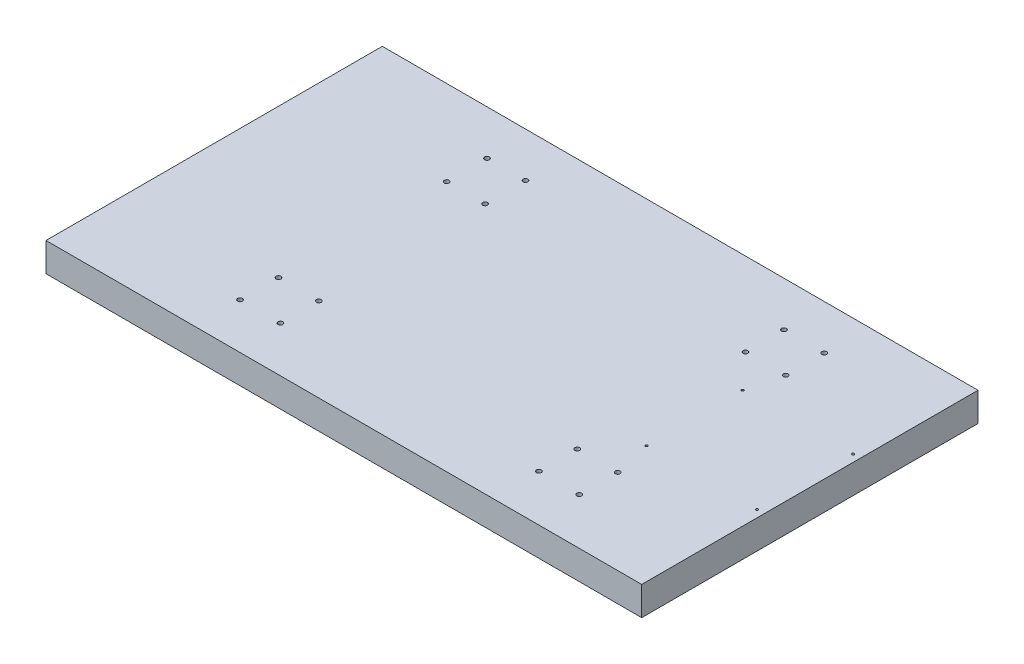
ISO-10303-21;
HEADER;
FILE_DESCRIPTION(('STEP AP214'),'2;1');
FILE_NAME('part.step','',(''),(''),'','','');
FILE_SCHEMA(('AUTOMOTIVE_DESIGN { 1 0 10303 214 1 1 1 1 }'));
ENDSEC;
DATA;
#1=APPLICATION_CONTEXT('core data for automotive mechanical design processes');
#2=APPLICATION_PROTOCOL_DEFINITION('international standard','automotive_design',2000,#1);
#3=PRODUCT_CONTEXT('',#1,'mechanical');
#4=PRODUCT('Part','Part','',(#3));
#5=PRODUCT_RELATED_PRODUCT_CATEGORY('part','',(#4));
#6=PRODUCT_DEFINITION_FORMATION('','',#4);
#7=PRODUCT_DEFINITION_CONTEXT('part definition',#1,'design');
#8=PRODUCT_DEFINITION('design','',#6,#7);
#9=PRODUCT_DEFINITION_SHAPE('','',#8);
#10=(LENGTH_UNIT() NAMED_UNIT(*) SI_UNIT(.MILLI.,.METRE.));
#11=(NAMED_UNIT(*) PLANE_ANGLE_UNIT() SI_UNIT($,.RADIAN.));
#12=(NAMED_UNIT(*) SI_UNIT($,.STERADIAN.) SOLID_ANGLE_UNIT());
#13=UNCERTAINTY_MEASURE_WITH_UNIT(LENGTH_MEASURE(1.E-05),#10,'distance_accuracy_value','');
#14=(GEOMETRIC_REPRESENTATION_CONTEXT(3) GLOBAL_UNCERTAINTY_ASSIGNED_CONTEXT((#13)) GLOBAL_UNIT_ASSIGNED_CONTEXT((#10,
#11,#12)) REPRESENTATION_CONTEXT('',''));
#15=CARTESIAN_POINT('',(0.,0.,0.));
#16=DIRECTION('',(0.,0.,1.));
#17=DIRECTION('',(1.,0.,0.));
#18=AXIS2_PLACEMENT_3D('',#15,#16,#17);
#19=CARTESIAN_POINT('',(-876.3,76.2,-444.5));
#20=DIRECTION('',(0.,0.,1.));
#21=DIRECTION('',(1.,0.,0.));
#22=AXIS2_PLACEMENT_3D('',#19,#20,#21);
#23=PLANE('',#22);
#24=CARTESIAN_POINT('',(-190.500000000017,38.1000000000064,-444.5));
#25=DIRECTION('',(0.,0.,-1.));
#26=DIRECTION('',(-1.,0.,0.));
#27=AXIS2_PLACEMENT_3D('',#24,#25,#26);
#28=CIRCLE('',#27,6.34999999998246);
#29=CARTESIAN_POINT('',(-196.849999999999,38.1000000000064,-444.5));
#30=VERTEX_POINT('',#29);
#31=EDGE_CURVE('E268',#30,#30,#28,.T.);
#32=ORIENTED_EDGE('',*,*,#31,.F.);
#33=EDGE_LOOP('',(#32));
#34=FACE_BOUND('',#33,.T.);
#35=CARTESIAN_POINT('',(-647.700000000017,38.1000000000063,-444.5));
#36=DIRECTION('',(0.,0.,-1.));
#37=DIRECTION('',(-1.,0.,0.));
#38=AXIS2_PLACEMENT_3D('',#35,#36,#37);
#39=CIRCLE('',#38,6.34999999998258);
#40=CARTESIAN_POINT('',(-654.049999999999,38.1000000000063,-444.5));
#41=VERTEX_POINT('',#40);
#42=EDGE_CURVE('E263',#41,#41,#39,.T.);
#43=ORIENTED_EDGE('',*,*,#42,.F.);
#44=EDGE_LOOP('',(#43));
#45=FACE_BOUND('',#44,.T.);
#46=DIRECTION('',(0.,1.,0.));
#47=VECTOR('',#46,1.);
#48=CARTESIAN_POINT('',(368.3,0.,-444.5));
#49=LINE('',#48,#47);
#50=CARTESIAN_POINT('',(368.3,0.,-444.5));
#51=VERTEX_POINT('',#50);
#52=CARTESIAN_POINT('',(368.3,76.2,-444.5));
#53=VERTEX_POINT('',#52);
#54=EDGE_CURVE('E91',#51,#53,#49,.T.);
#55=ORIENTED_EDGE('',*,*,#54,.F.);
#56=DIRECTION('',(-1.,0.,0.));
#57=VECTOR('',#56,1.);
#58=CARTESIAN_POINT('',(-876.3,0.,-444.5));
#59=LINE('',#58,#57);
#60=CARTESIAN_POINT('',(-1206.5,0.,-444.5));
#61=VERTEX_POINT('',#60);
#62=EDGE_CURVE('E99',#51,#61,#59,.T.);
#63=ORIENTED_EDGE('',*,*,#62,.T.);
#64=DIRECTION('',(0.,-1.,0.));
#65=VECTOR('',#64,1.);
#66=CARTESIAN_POINT('',(-1206.5,76.2,-444.5));
#67=LINE('',#66,#65);
#68=CARTESIAN_POINT('',(-1206.5,76.2,-444.5));
#69=VERTEX_POINT('',#68);
#70=EDGE_CURVE('E123',#69,#61,#67,.T.);
#71=ORIENTED_EDGE('',*,*,#70,.F.);
#72=DIRECTION('',(-1.,0.,0.));
#73=VECTOR('',#72,1.);
#74=CARTESIAN_POINT('',(-876.3,76.2,-444.5));
#75=LINE('',#74,#73);
#76=EDGE_CURVE('E56',#53,#69,#75,.T.);
#77=ORIENTED_EDGE('',*,*,#76,.F.);
#78=EDGE_LOOP('',(#55,#63,#71,#77));
#79=FACE_BOUND('',#78,.T.);
#80=ADVANCED_FACE('F47',(#34,#45,#79),#23,.F.);
#81=CARTESIAN_POINT('',(-876.3,76.2,444.5));
#82=DIRECTION('',(0.,0.,-1.));
#83=DIRECTION('',(-1.,0.,0.));
#84=AXIS2_PLACEMENT_3D('',#81,#82,#83);
#85=PLANE('',#84);
#86=DIRECTION('',(0.,-1.,0.));
#87=VECTOR('',#86,1.);
#88=CARTESIAN_POINT('',(368.3,76.2,444.5));
#89=LINE('',#88,#87);
#90=CARTESIAN_POINT('',(368.3,76.2,444.5));
#91=VERTEX_POINT('',#90);
#92=CARTESIAN_POINT('',(368.3,0.,444.5));
#93=VERTEX_POINT('',#92);
#94=EDGE_CURVE('E64',#91,#93,#89,.T.);
#95=ORIENTED_EDGE('',*,*,#94,.F.);
#96=DIRECTION('',(1.,0.,0.));
#97=VECTOR('',#96,1.);
#98=CARTESIAN_POINT('',(-876.3,76.2,444.5));
#99=LINE('',#98,#97);
#100=CARTESIAN_POINT('',(-1206.5,76.2,444.5));
#101=VERTEX_POINT('',#100);
#102=EDGE_CURVE('E11',#101,#91,#99,.T.);
#103=ORIENTED_EDGE('',*,*,#102,.F.);
#104=DIRECTION('',(0.,1.,0.));
#105=VECTOR('',#104,1.);
#106=CARTESIAN_POINT('',(-1206.5,0.,444.5));
#107=LINE('',#106,#105);
#108=CARTESIAN_POINT('',(-1206.5,0.,444.5));
#109=VERTEX_POINT('',#108);
#110=EDGE_CURVE('E113',#109,#101,#107,.T.);
#111=ORIENTED_EDGE('',*,*,#110,.F.);
#112=DIRECTION('',(1.,0.,0.));
#113=VECTOR('',#112,1.);
#114=CARTESIAN_POINT('',(-876.3,0.,444.5));
#115=LINE('',#114,#113);
#116=EDGE_CURVE('E50',#109,#93,#115,.T.);
#117=ORIENTED_EDGE('',*,*,#116,.T.);
#118=EDGE_LOOP('',(#95,#103,#111,#117));
#119=FACE_BOUND('',#118,.T.);
#120=ADVANCED_FACE('F313',(#119),#85,.F.);
#121=CARTESIAN_POINT('',(0.,76.2,0.));
#122=DIRECTION('',(0.,1.,0.));
#123=DIRECTION('',(0.,0.,1.));
#124=AXIS2_PLACEMENT_3D('',#121,#122,#123);
#125=PLANE('',#124);
#126=CARTESIAN_POINT('',(57.1499999999836,76.2,-133.35));
#127=DIRECTION('',(0.,1.,0.));
#128=DIRECTION('',(0.,0.,1.));
#129=AXIS2_PLACEMENT_3D('',#126,#127,#128);
#130=CIRCLE('',#129,3.17500000001563);
#131=CARTESIAN_POINT('',(57.1499999999836,76.2,-130.174999999984));
#132=VERTEX_POINT('',#131);
#133=EDGE_CURVE('E287',#132,#132,#130,.T.);
#134=ORIENTED_EDGE('',*,*,#133,.F.);
#135=EDGE_LOOP('',(#134));
#136=FACE_BOUND('',#135,.T.);
#137=CARTESIAN_POINT('',(57.1499999999836,76.2,120.65));
#138=DIRECTION('',(0.,1.,0.));
#139=DIRECTION('',(0.,0.,1.));
#140=AXIS2_PLACEMENT_3D('',#137,#138,#139);
#141=CIRCLE('',#140,3.17500000001563);
#142=CARTESIAN_POINT('',(57.1499999999836,76.2,123.825000000016));
#143=VERTEX_POINT('',#142);
#144=EDGE_CURVE('E295',#143,#143,#141,.T.);
#145=ORIENTED_EDGE('',*,*,#144,.F.);
#146=EDGE_LOOP('',(#145));
#147=FACE_BOUND('',#146,.T.);
#148=CARTESIAN_POINT('',(349.249999999984,76.2,120.65));
#149=DIRECTION('',(0.,1.,0.));
#150=DIRECTION('',(0.,0.,1.));
#151=AXIS2_PLACEMENT_3D('',#148,#149,#150);
#152=CIRCLE('',#151,3.1750000000156);
#153=CARTESIAN_POINT('',(349.249999999984,76.2,123.825000000015));
#154=VERTEX_POINT('',#153);
#155=EDGE_CURVE('E279',#154,#154,#152,.T.);
#156=ORIENTED_EDGE('',*,*,#155,.F.);
#157=EDGE_LOOP('',(#156));
#158=FACE_BOUND('',#157,.T.);
#159=CARTESIAN_POINT('',(349.249999999984,76.2,-133.35));
#160=DIRECTION('',(0.,1.,0.));
#161=DIRECTION('',(0.,0.,1.));
#162=AXIS2_PLACEMENT_3D('',#159,#160,#161);
#163=CIRCLE('',#162,3.1750000000156);
#164=CARTESIAN_POINT('',(349.249999999984,76.2,-130.174999999984));
#165=VERTEX_POINT('',#164);
#166=EDGE_CURVE('E275',#165,#165,#163,.T.);
#167=ORIENTED_EDGE('',*,*,#166,.F.);
#168=EDGE_LOOP('',(#167));
#169=FACE_BOUND('',#168,.T.);
#170=CARTESIAN_POINT('',(-26.7580632516862,76.2,219.722));
#171=DIRECTION('',(0.,1.,0.));
#172=DIRECTION('',(0.,0.,1.));
#173=AXIS2_PLACEMENT_3D('',#170,#171,#172);
#174=CIRCLE('',#173,6.35000000000001);
#175=CARTESIAN_POINT('',(-26.7580632516862,76.2,226.072));
#176=VERTEX_POINT('',#175);
#177=EDGE_CURVE('E175',#176,#176,#174,.T.);
#178=ORIENTED_EDGE('',*,*,#177,.F.);
#179=EDGE_LOOP('',(#178));
#180=FACE_BOUND('',#179,.T.);
#181=CARTESIAN_POINT('',(-26.7340632516861,76.2,-224.802000000001));
#182=DIRECTION('',(0.,1.,0.));
#183=DIRECTION('',(0.,0.,1.));
#184=AXIS2_PLACEMENT_3D('',#181,#182,#183);
#185=CIRCLE('',#184,6.35000000000001);
#186=CARTESIAN_POINT('',(-26.7340632516861,76.2,-218.452000000001));
#187=VERTEX_POINT('',#186);
#188=EDGE_CURVE('E184',#187,#187,#185,.T.);
#189=ORIENTED_EDGE('',*,*,#188,.F.);
#190=EDGE_LOOP('',(#189));
#191=FACE_BOUND('',#190,.T.);
#192=CARTESIAN_POINT('',(79.9459367483139,76.2,-224.802000000001));
#193=DIRECTION('',(0.,1.,0.));
#194=DIRECTION('',(0.,0.,1.));
#195=AXIS2_PLACEMENT_3D('',#192,#193,#194);
#196=CIRCLE('',#195,6.35000000000006);
#197=CARTESIAN_POINT('',(79.9459367483139,76.2,-218.452));
#198=VERTEX_POINT('',#197);
#199=EDGE_CURVE('E192',#198,#198,#196,.T.);
#200=ORIENTED_EDGE('',*,*,#199,.F.);
#201=EDGE_LOOP('',(#200));
#202=FACE_BOUND('',#201,.T.);
#203=CARTESIAN_POINT('',(79.9459367483139,76.2,-326.402));
#204=DIRECTION('',(0.,1.,0.));
#205=DIRECTION('',(0.,0.,1.));
#206=AXIS2_PLACEMENT_3D('',#203,#204,#205);
#207=CIRCLE('',#206,6.35000000000003);
#208=CARTESIAN_POINT('',(79.9459367483139,76.2,-320.052));
#209=VERTEX_POINT('',#208);
#210=EDGE_CURVE('E160',#209,#209,#207,.T.);
#211=ORIENTED_EDGE('',*,*,#210,.F.);
#212=EDGE_LOOP('',(#211));
#213=FACE_BOUND('',#212,.T.);
#214=CARTESIAN_POINT('',(-811.594063251686,76.2,-326.402));
#215=DIRECTION('',(0.,1.,0.));
#216=DIRECTION('',(0.,0.,1.));
#217=AXIS2_PLACEMENT_3D('',#214,#215,#216);
#218=CIRCLE('',#217,6.35000000000006);
#219=CARTESIAN_POINT('',(-811.594063251686,76.2,-320.052));
#220=VERTEX_POINT('',#219);
#221=EDGE_CURVE('E135',#220,#220,#218,.T.);
#222=ORIENTED_EDGE('',*,*,#221,.F.);
#223=EDGE_LOOP('',(#222));
#224=FACE_BOUND('',#223,.T.);
#225=CARTESIAN_POINT('',(-709.994063251686,76.2,-326.402));
#226=DIRECTION('',(0.,1.,0.));
#227=DIRECTION('',(0.,0.,1.));
#228=AXIS2_PLACEMENT_3D('',#225,#226,#227);
#229=CIRCLE('',#228,6.35000000000006);
#230=CARTESIAN_POINT('',(-709.994063251686,76.2,-320.052));
#231=VERTEX_POINT('',#230);
#232=EDGE_CURVE('E143',#231,#231,#229,.T.);
#233=ORIENTED_EDGE('',*,*,#232,.F.);
#234=EDGE_LOOP('',(#233));
#235=FACE_BOUND('',#234,.T.);
#236=CARTESIAN_POINT('',(-709.994063251686,76.2,-219.722));
#237=DIRECTION('',(0.,1.,0.));
#238=DIRECTION('',(0.,0.,1.));
#239=AXIS2_PLACEMENT_3D('',#236,#237,#238);
#240=CIRCLE('',#239,6.35000000000006);
#241=CARTESIAN_POINT('',(-709.994063251686,76.2,-213.372));
#242=VERTEX_POINT('',#241);
#243=EDGE_CURVE('E144',#242,#242,#240,.T.);
#244=ORIENTED_EDGE('',*,*,#243,.F.);
#245=EDGE_LOOP('',(#244));
#246=FACE_BOUND('',#245,.T.);
#247=CARTESIAN_POINT('',(-26.7340632516861,76.2,-326.402));
#248=DIRECTION('',(0.,1.,0.));
#249=DIRECTION('',(0.,0.,1.));
#250=AXIS2_PLACEMENT_3D('',#247,#248,#249);
#251=CIRCLE('',#250,6.35000000000002);
#252=CARTESIAN_POINT('',(-26.7340632516861,76.2,-320.052));
#253=VERTEX_POINT('',#252);
#254=EDGE_CURVE('E159',#253,#253,#251,.T.);
#255=ORIENTED_EDGE('',*,*,#254,.F.);
#256=EDGE_LOOP('',(#255));
#257=FACE_BOUND('',#256,.T.);
#258=CARTESIAN_POINT('',(-814.158063251686,76.2,222.261999999999));
#259=DIRECTION('',(0.,1.,0.));
#260=DIRECTION('',(0.,0.,1.));
#261=AXIS2_PLACEMENT_3D('',#258,#259,#260);
#262=CIRCLE('',#261,6.35000000000017);
#263=CARTESIAN_POINT('',(-814.158063251686,76.2,228.612));
#264=VERTEX_POINT('',#263);
#265=EDGE_CURVE('E239',#264,#264,#262,.T.);
#266=ORIENTED_EDGE('',*,*,#265,.F.);
#267=EDGE_LOOP('',(#266));
#268=FACE_BOUND('',#267,.T.);
#269=CARTESIAN_POINT('',(-814.158063251686,76.2,323.861999999999));
#270=DIRECTION('',(0.,1.,0.));
#271=DIRECTION('',(0.,0.,1.));
#272=AXIS2_PLACEMENT_3D('',#269,#270,#271);
#273=CIRCLE('',#272,6.35000000000017);
#274=CARTESIAN_POINT('',(-814.158063251686,76.2,330.212));
#275=VERTEX_POINT('',#274);
#276=EDGE_CURVE('E248',#275,#275,#273,.T.);
#277=ORIENTED_EDGE('',*,*,#276,.F.);
#278=EDGE_LOOP('',(#277));
#279=FACE_BOUND('',#278,.T.);
#280=CARTESIAN_POINT('',(-707.478063251686,76.2,323.861999999999));
#281=DIRECTION('',(0.,1.,0.));
#282=DIRECTION('',(0.,0.,1.));
#283=AXIS2_PLACEMENT_3D('',#280,#281,#282);
#284=CIRCLE('',#283,6.35000000000017);
#285=CARTESIAN_POINT('',(-707.478063251686,76.2,330.212));
#286=VERTEX_POINT('',#285);
#287=EDGE_CURVE('E208',#286,#286,#284,.T.);
#288=ORIENTED_EDGE('',*,*,#287,.F.);
#289=EDGE_LOOP('',(#288));
#290=FACE_BOUND('',#289,.T.);
#291=CARTESIAN_POINT('',(-707.478063251686,76.2,222.261999999999));
#292=DIRECTION('',(0.,1.,0.));
#293=DIRECTION('',(0.,0.,1.));
#294=AXIS2_PLACEMENT_3D('',#291,#292,#293);
#295=CIRCLE('',#294,6.35000000000017);
#296=CARTESIAN_POINT('',(-707.478063251686,76.2,228.612));
#297=VERTEX_POINT('',#296);
#298=EDGE_CURVE('E207',#297,#297,#295,.T.);
#299=ORIENTED_EDGE('',*,*,#298,.F.);
#300=EDGE_LOOP('',(#299));
#301=FACE_BOUND('',#300,.T.);
#302=CARTESIAN_POINT('',(-26.7580632516862,76.2,321.322));
#303=DIRECTION('',(0.,1.,0.));
#304=DIRECTION('',(0.,0.,1.));
#305=AXIS2_PLACEMENT_3D('',#302,#303,#304);
#306=CIRCLE('',#305,6.35000000000001);
#307=CARTESIAN_POINT('',(-26.7580632516862,76.2,327.672));
#308=VERTEX_POINT('',#307);
#309=EDGE_CURVE('E216',#308,#308,#306,.T.);
#310=ORIENTED_EDGE('',*,*,#309,.F.);
#311=EDGE_LOOP('',(#310));
#312=FACE_BOUND('',#311,.T.);
#313=CARTESIAN_POINT('',(79.9219367483138,76.2,321.322));
#314=DIRECTION('',(0.,1.,0.));
#315=DIRECTION('',(0.,0.,1.));
#316=AXIS2_PLACEMENT_3D('',#313,#314,#315);
#317=CIRCLE('',#316,6.35000000000003);
#318=CARTESIAN_POINT('',(79.9219367483138,76.2,327.672));
#319=VERTEX_POINT('',#318);
#320=EDGE_CURVE('E224',#319,#319,#317,.T.);
#321=ORIENTED_EDGE('',*,*,#320,.F.);
#322=EDGE_LOOP('',(#321));
#323=FACE_BOUND('',#322,.T.);
#324=CARTESIAN_POINT('',(79.9219367483138,76.2,219.722));
#325=DIRECTION('',(0.,1.,0.));
#326=DIRECTION('',(0.,0.,1.));
#327=AXIS2_PLACEMENT_3D('',#324,#325,#326);
#328=CIRCLE('',#327,6.35000000000004);
#329=CARTESIAN_POINT('',(79.9219367483138,76.2,226.072));
#330=VERTEX_POINT('',#329);
#331=EDGE_CURVE('E176',#330,#330,#328,.T.);
#332=ORIENTED_EDGE('',*,*,#331,.F.);
#333=EDGE_LOOP('',(#332));
#334=FACE_BOUND('',#333,.T.);
#335=CARTESIAN_POINT('',(-811.594063251686,76.2,-219.722));
#336=DIRECTION('',(0.,1.,0.));
#337=DIRECTION('',(0.,0.,1.));
#338=AXIS2_PLACEMENT_3D('',#335,#336,#337);
#339=CIRCLE('',#338,6.35000000000006);
#340=CARTESIAN_POINT('',(-811.594063251686,76.2,-213.372));
#341=VERTEX_POINT('',#340);
#342=EDGE_CURVE('E131',#341,#341,#339,.T.);
#343=ORIENTED_EDGE('',*,*,#342,.F.);
#344=EDGE_LOOP('',(#343));
#345=FACE_BOUND('',#344,.T.);
#346=ORIENTED_EDGE('',*,*,#102,.T.);
#347=DIRECTION('',(0.,0.,1.));
#348=VECTOR('',#347,1.);
#349=CARTESIAN_POINT('',(368.3,76.2,-444.5));
#350=LINE('',#349,#348);
#351=EDGE_CURVE('E102',#53,#91,#350,.T.);
#352=ORIENTED_EDGE('',*,*,#351,.F.);
#353=ORIENTED_EDGE('',*,*,#76,.T.);
#354=DIRECTION('',(0.,0.,-1.));
#355=VECTOR('',#354,1.);
#356=CARTESIAN_POINT('',(-1206.5,76.2,444.5));
#357=LINE('',#356,#355);
#358=EDGE_CURVE('E109',#101,#69,#357,.T.);
#359=ORIENTED_EDGE('',*,*,#358,.F.);
#360=EDGE_LOOP('',(#346,#352,#353,#359));
#361=FACE_BOUND('',#360,.T.);
#362=ADVANCED_FACE('F310',(#136,#147,#158,#169,#180,#191,#202,#213,#224,#235,#246,#257,#268,
#279,#290,#301,#312,#323,#334,#345,#361),#125,.T.);
#363=CARTESIAN_POINT('',(0.,0.,0.));
#364=DIRECTION('',(0.,1.,0.));
#365=DIRECTION('',(0.,0.,1.));
#366=AXIS2_PLACEMENT_3D('',#363,#364,#365);
#367=PLANE('',#366);
#368=DIRECTION('',(0.,0.,-1.));
#369=VECTOR('',#368,1.);
#370=CARTESIAN_POINT('',(368.3,0.,444.5));
#371=LINE('',#370,#369);
#372=EDGE_CURVE('E88',#93,#51,#371,.T.);
#373=ORIENTED_EDGE('',*,*,#372,.F.);
#374=ORIENTED_EDGE('',*,*,#116,.F.);
#375=DIRECTION('',(0.,0.,1.));
#376=VECTOR('',#375,1.);
#377=CARTESIAN_POINT('',(-1206.5,0.,-444.5));
#378=LINE('',#377,#376);
#379=EDGE_CURVE('E106',#61,#109,#378,.T.);
#380=ORIENTED_EDGE('',*,*,#379,.F.);
#381=ORIENTED_EDGE('',*,*,#62,.F.);
#382=EDGE_LOOP('',(#373,#374,#380,#381));
#383=FACE_BOUND('',#382,.T.);
#384=ADVANCED_FACE('F104',(#383),#367,.F.);
#385=CARTESIAN_POINT('',(-1206.5,0.,2.60109394340751E-13));
#386=DIRECTION('',(-1.,0.,0.));
#387=DIRECTION('',(0.,0.,1.));
#388=AXIS2_PLACEMENT_3D('',#385,#386,#387);
#389=PLANE('',#388);
#390=ORIENTED_EDGE('',*,*,#70,.T.);
#391=ORIENTED_EDGE('',*,*,#379,.T.);
#392=ORIENTED_EDGE('',*,*,#110,.T.);
#393=ORIENTED_EDGE('',*,*,#358,.T.);
#394=EDGE_LOOP('',(#390,#391,#392,#393));
#395=FACE_BOUND('',#394,.T.);
#396=ADVANCED_FACE('F352',(#395),#389,.T.);
#397=CARTESIAN_POINT('',(368.3,0.,0.));
#398=DIRECTION('',(1.,0.,0.));
#399=DIRECTION('',(0.,0.,-1.));
#400=AXIS2_PLACEMENT_3D('',#397,#398,#399);
#401=PLANE('',#400);
#402=ORIENTED_EDGE('',*,*,#94,.T.);
#403=ORIENTED_EDGE('',*,*,#372,.T.);
#404=ORIENTED_EDGE('',*,*,#54,.T.);
#405=ORIENTED_EDGE('',*,*,#351,.T.);
#406=EDGE_LOOP('',(#402,#403,#404,#405));
#407=FACE_BOUND('',#406,.T.);
#408=ADVANCED_FACE('F90',(#407),#401,.T.);
#409=CARTESIAN_POINT('',(-811.594063251686,2.54,-219.722));
#410=DIRECTION('',(0.,1.,0.));
#411=DIRECTION('',(0.,0.,1.));
#412=AXIS2_PLACEMENT_3D('',#409,#410,#411);
#413=CYLINDRICAL_SURFACE('',#412,6.35000000000006);
#414=CARTESIAN_POINT('',(-811.594063251686,2.54,-219.722));
#415=DIRECTION('',(0.,1.,0.));
#416=DIRECTION('',(0.,0.,1.));
#417=AXIS2_PLACEMENT_3D('',#414,#415,#416);
#418=CIRCLE('',#417,6.35000000000006);
#419=CARTESIAN_POINT('',(-811.594063251686,2.54,-213.372));
#420=VERTEX_POINT('',#419);
#421=EDGE_CURVE('E130',#420,#420,#418,.T.);
#422=ORIENTED_EDGE('',*,*,#421,.F.);
#423=EDGE_LOOP('',(#422));
#424=FACE_BOUND('',#423,.T.);
#425=ORIENTED_EDGE('',*,*,#342,.T.);
#426=EDGE_LOOP('',(#425));
#427=FACE_BOUND('',#426,.T.);
#428=ADVANCED_FACE('F359',(#424,#427),#413,.F.);
#429=CARTESIAN_POINT('',(-811.594063251686,2.54,-219.722));
#430=DIRECTION('',(0.,1.,0.));
#431=DIRECTION('',(0.,0.,1.));
#432=AXIS2_PLACEMENT_3D('',#429,#430,#431);
#433=PLANE('',#432);
#434=ORIENTED_EDGE('',*,*,#421,.T.);
#435=EDGE_LOOP('',(#434));
#436=FACE_BOUND('',#435,.T.);
#437=ADVANCED_FACE('F421',(#436),#433,.T.);
#438=CARTESIAN_POINT('',(79.9219367483138,2.54,219.722));
#439=DIRECTION('',(0.,1.,0.));
#440=DIRECTION('',(0.,0.,1.));
#441=AXIS2_PLACEMENT_3D('',#438,#439,#440);
#442=CYLINDRICAL_SURFACE('',#441,6.35000000000004);
#443=CARTESIAN_POINT('',(79.9219367483138,2.54,219.722));
#444=DIRECTION('',(0.,1.,0.));
#445=DIRECTION('',(0.,0.,1.));
#446=AXIS2_PLACEMENT_3D('',#443,#444,#445);
#447=CIRCLE('',#446,6.35000000000004);
#448=CARTESIAN_POINT('',(79.9219367483138,2.54,226.072));
#449=VERTEX_POINT('',#448);
#450=EDGE_CURVE('E228',#449,#449,#447,.T.);
#451=ORIENTED_EDGE('',*,*,#450,.F.);
#452=EDGE_LOOP('',(#451));
#453=FACE_BOUND('',#452,.T.);
#454=ORIENTED_EDGE('',*,*,#331,.T.);
#455=EDGE_LOOP('',(#454));
#456=FACE_BOUND('',#455,.T.);
#457=ADVANCED_FACE('F417',(#453,#456),#442,.F.);
#458=CARTESIAN_POINT('',(79.9219367483138,2.54,219.722));
#459=DIRECTION('',(0.,1.,0.));
#460=DIRECTION('',(0.,0.,1.));
#461=AXIS2_PLACEMENT_3D('',#458,#459,#460);
#462=PLANE('',#461);
#463=ORIENTED_EDGE('',*,*,#450,.T.);
#464=EDGE_LOOP('',(#463));
#465=FACE_BOUND('',#464,.T.);
#466=ADVANCED_FACE('F420',(#465),#462,.T.);
#467=CARTESIAN_POINT('',(79.9219367483138,2.54,321.322));
#468=DIRECTION('',(0.,1.,0.));
#469=DIRECTION('',(0.,0.,1.));
#470=AXIS2_PLACEMENT_3D('',#467,#468,#469);
#471=CYLINDRICAL_SURFACE('',#470,6.35000000000003);
#472=CARTESIAN_POINT('',(79.9219367483138,2.54,321.322));
#473=DIRECTION('',(0.,1.,0.));
#474=DIRECTION('',(0.,0.,1.));
#475=AXIS2_PLACEMENT_3D('',#472,#473,#474);
#476=CIRCLE('',#475,6.35000000000003);
#477=CARTESIAN_POINT('',(79.9219367483138,2.54,327.672));
#478=VERTEX_POINT('',#477);
#479=EDGE_CURVE('E220',#478,#478,#476,.T.);
#480=ORIENTED_EDGE('',*,*,#479,.F.);
#481=EDGE_LOOP('',(#480));
#482=FACE_BOUND('',#481,.T.);
#483=ORIENTED_EDGE('',*,*,#320,.T.);
#484=EDGE_LOOP('',(#483));
#485=FACE_BOUND('',#484,.T.);
#486=ADVANCED_FACE('F425',(#482,#485),#471,.F.);
#487=CARTESIAN_POINT('',(79.9219367483138,2.54,321.322));
#488=DIRECTION('',(0.,1.,0.));
#489=DIRECTION('',(0.,0.,1.));
#490=AXIS2_PLACEMENT_3D('',#487,#488,#489);
#491=PLANE('',#490);
#492=ORIENTED_EDGE('',*,*,#479,.T.);
#493=EDGE_LOOP('',(#492));
#494=FACE_BOUND('',#493,.T.);
#495=ADVANCED_FACE('F429',(#494),#491,.T.);
#496=CARTESIAN_POINT('',(-26.7580632516862,2.54,321.322));
#497=DIRECTION('',(0.,1.,0.));
#498=DIRECTION('',(0.,0.,1.));
#499=AXIS2_PLACEMENT_3D('',#496,#497,#498);
#500=CYLINDRICAL_SURFACE('',#499,6.35000000000001);
#501=CARTESIAN_POINT('',(-26.7580632516862,2.54,321.322));
#502=DIRECTION('',(0.,1.,0.));
#503=DIRECTION('',(0.,0.,1.));
#504=AXIS2_PLACEMENT_3D('',#501,#502,#503);
#505=CIRCLE('',#504,6.35000000000001);
#506=CARTESIAN_POINT('',(-26.7580632516862,2.54,327.672));
#507=VERTEX_POINT('',#506);
#508=EDGE_CURVE('E212',#507,#507,#505,.T.);
#509=ORIENTED_EDGE('',*,*,#508,.F.);
#510=EDGE_LOOP('',(#509));
#511=FACE_BOUND('',#510,.T.);
#512=ORIENTED_EDGE('',*,*,#309,.T.);
#513=EDGE_LOOP('',(#512));
#514=FACE_BOUND('',#513,.T.);
#515=ADVANCED_FACE('F433',(#511,#514),#500,.F.);
#516=CARTESIAN_POINT('',(-26.7580632516862,2.54,321.322));
#517=DIRECTION('',(0.,1.,0.));
#518=DIRECTION('',(0.,0.,1.));
#519=AXIS2_PLACEMENT_3D('',#516,#517,#518);
#520=PLANE('',#519);
#521=ORIENTED_EDGE('',*,*,#508,.T.);
#522=EDGE_LOOP('',(#521));
#523=FACE_BOUND('',#522,.T.);
#524=ADVANCED_FACE('F437',(#523),#520,.T.);
#525=CARTESIAN_POINT('',(-707.478063251686,2.54,222.261999999999));
#526=DIRECTION('',(0.,1.,0.));
#527=DIRECTION('',(0.,0.,1.));
#528=AXIS2_PLACEMENT_3D('',#525,#526,#527);
#529=CYLINDRICAL_SURFACE('',#528,6.35000000000017);
#530=CARTESIAN_POINT('',(-707.478063251686,2.54,222.261999999999));
#531=DIRECTION('',(0.,1.,0.));
#532=DIRECTION('',(0.,0.,1.));
#533=AXIS2_PLACEMENT_3D('',#530,#531,#532);
#534=CIRCLE('',#533,6.35000000000017);
#535=CARTESIAN_POINT('',(-707.478063251686,2.54,228.612));
#536=VERTEX_POINT('',#535);
#537=EDGE_CURVE('E203',#536,#536,#534,.T.);
#538=ORIENTED_EDGE('',*,*,#537,.F.);
#539=EDGE_LOOP('',(#538));
#540=FACE_BOUND('',#539,.T.);
#541=ORIENTED_EDGE('',*,*,#298,.T.);
#542=EDGE_LOOP('',(#541));
#543=FACE_BOUND('',#542,.T.);
#544=ADVANCED_FACE('F441',(#540,#543),#529,.F.);
#545=CARTESIAN_POINT('',(-707.478063251686,2.54,222.261999999999));
#546=DIRECTION('',(0.,1.,0.));
#547=DIRECTION('',(0.,0.,1.));
#548=AXIS2_PLACEMENT_3D('',#545,#546,#547);
#549=PLANE('',#548);
#550=ORIENTED_EDGE('',*,*,#537,.T.);
#551=EDGE_LOOP('',(#550));
#552=FACE_BOUND('',#551,.T.);
#553=ADVANCED_FACE('F395',(#552),#549,.T.);
#554=CARTESIAN_POINT('',(-707.478063251686,2.54,323.861999999999));
#555=DIRECTION('',(0.,1.,0.));
#556=DIRECTION('',(0.,0.,1.));
#557=AXIS2_PLACEMENT_3D('',#554,#555,#556);
#558=CYLINDRICAL_SURFACE('',#557,6.35000000000017);
#559=CARTESIAN_POINT('',(-707.478063251686,2.54,323.861999999999));
#560=DIRECTION('',(0.,1.,0.));
#561=DIRECTION('',(0.,0.,1.));
#562=AXIS2_PLACEMENT_3D('',#559,#560,#561);
#563=CIRCLE('',#562,6.35000000000017);
#564=CARTESIAN_POINT('',(-707.478063251686,2.54,330.212));
#565=VERTEX_POINT('',#564);
#566=EDGE_CURVE('E252',#565,#565,#563,.T.);
#567=ORIENTED_EDGE('',*,*,#566,.F.);
#568=EDGE_LOOP('',(#567));
#569=FACE_BOUND('',#568,.T.);
#570=ORIENTED_EDGE('',*,*,#287,.T.);
#571=EDGE_LOOP('',(#570));
#572=FACE_BOUND('',#571,.T.);
#573=ADVANCED_FACE('F391',(#569,#572),#558,.F.);
#574=CARTESIAN_POINT('',(-707.478063251686,2.54,323.861999999999));
#575=DIRECTION('',(0.,1.,0.));
#576=DIRECTION('',(0.,0.,1.));
#577=AXIS2_PLACEMENT_3D('',#574,#575,#576);
#578=PLANE('',#577);
#579=ORIENTED_EDGE('',*,*,#566,.T.);
#580=EDGE_LOOP('',(#579));
#581=FACE_BOUND('',#580,.T.);
#582=ADVANCED_FACE('F394',(#581),#578,.T.);
#583=CARTESIAN_POINT('',(-814.158063251686,2.54,323.861999999999));
#584=DIRECTION('',(0.,1.,0.));
#585=DIRECTION('',(0.,0.,1.));
#586=AXIS2_PLACEMENT_3D('',#583,#584,#585);
#587=CYLINDRICAL_SURFACE('',#586,6.35000000000017);
#588=CARTESIAN_POINT('',(-814.158063251686,2.54,323.861999999999));
#589=DIRECTION('',(0.,1.,0.));
#590=DIRECTION('',(0.,0.,1.));
#591=AXIS2_PLACEMENT_3D('',#588,#589,#590);
#592=CIRCLE('',#591,6.35000000000017);
#593=CARTESIAN_POINT('',(-814.158063251686,2.54,330.212));
#594=VERTEX_POINT('',#593);
#595=EDGE_CURVE('E244',#594,#594,#592,.T.);
#596=ORIENTED_EDGE('',*,*,#595,.F.);
#597=EDGE_LOOP('',(#596));
#598=FACE_BOUND('',#597,.T.);
#599=ORIENTED_EDGE('',*,*,#276,.T.);
#600=EDGE_LOOP('',(#599));
#601=FACE_BOUND('',#600,.T.);
#602=ADVANCED_FACE('F399',(#598,#601),#587,.F.);
#603=CARTESIAN_POINT('',(-814.158063251686,2.54,323.861999999999));
#604=DIRECTION('',(0.,1.,0.));
#605=DIRECTION('',(0.,0.,1.));
#606=AXIS2_PLACEMENT_3D('',#603,#604,#605);
#607=PLANE('',#606);
#608=ORIENTED_EDGE('',*,*,#595,.T.);
#609=EDGE_LOOP('',(#608));
#610=FACE_BOUND('',#609,.T.);
#611=ADVANCED_FACE('F403',(#610),#607,.T.);
#612=CARTESIAN_POINT('',(-814.158063251686,2.54,222.261999999999));
#613=DIRECTION('',(0.,1.,0.));
#614=DIRECTION('',(0.,0.,1.));
#615=AXIS2_PLACEMENT_3D('',#612,#613,#614);
#616=CYLINDRICAL_SURFACE('',#615,6.35000000000017);
#617=CARTESIAN_POINT('',(-814.158063251686,2.54,222.261999999999));
#618=DIRECTION('',(0.,1.,0.));
#619=DIRECTION('',(0.,0.,1.));
#620=AXIS2_PLACEMENT_3D('',#617,#618,#619);
#621=CIRCLE('',#620,6.35000000000017);
#622=CARTESIAN_POINT('',(-814.158063251686,2.54,228.612));
#623=VERTEX_POINT('',#622);
#624=EDGE_CURVE('E235',#623,#623,#621,.T.);
#625=ORIENTED_EDGE('',*,*,#624,.F.);
#626=EDGE_LOOP('',(#625));
#627=FACE_BOUND('',#626,.T.);
#628=ORIENTED_EDGE('',*,*,#265,.T.);
#629=EDGE_LOOP('',(#628));
#630=FACE_BOUND('',#629,.T.);
#631=ADVANCED_FACE('F407',(#627,#630),#616,.F.);
#632=CARTESIAN_POINT('',(-814.158063251686,2.54,222.261999999999));
#633=DIRECTION('',(0.,1.,0.));
#634=DIRECTION('',(0.,0.,1.));
#635=AXIS2_PLACEMENT_3D('',#632,#633,#634);
#636=PLANE('',#635);
#637=ORIENTED_EDGE('',*,*,#624,.T.);
#638=EDGE_LOOP('',(#637));
#639=FACE_BOUND('',#638,.T.);
#640=ADVANCED_FACE('F411',(#639),#636,.T.);
#641=CARTESIAN_POINT('',(-26.7340632516861,2.54,-326.402));
#642=DIRECTION('',(0.,1.,0.));
#643=DIRECTION('',(0.,0.,1.));
#644=AXIS2_PLACEMENT_3D('',#641,#642,#643);
#645=CYLINDRICAL_SURFACE('',#644,6.35000000000002);
#646=CARTESIAN_POINT('',(-26.7340632516861,2.54,-326.402));
#647=DIRECTION('',(0.,1.,0.));
#648=DIRECTION('',(0.,0.,1.));
#649=AXIS2_PLACEMENT_3D('',#646,#647,#648);
#650=CIRCLE('',#649,6.35000000000002);
#651=CARTESIAN_POINT('',(-26.7340632516861,2.54,-320.052));
#652=VERTEX_POINT('',#651);
#653=EDGE_CURVE('E155',#652,#652,#650,.T.);
#654=ORIENTED_EDGE('',*,*,#653,.F.);
#655=EDGE_LOOP('',(#654));
#656=FACE_BOUND('',#655,.T.);
#657=ORIENTED_EDGE('',*,*,#254,.T.);
#658=EDGE_LOOP('',(#657));
#659=FACE_BOUND('',#658,.T.);
#660=ADVANCED_FACE('F415',(#656,#659),#645,.F.);
#661=CARTESIAN_POINT('',(-26.7340632516861,2.54,-326.402));
#662=DIRECTION('',(0.,1.,0.));
#663=DIRECTION('',(0.,0.,1.));
#664=AXIS2_PLACEMENT_3D('',#661,#662,#663);
#665=PLANE('',#664);
#666=ORIENTED_EDGE('',*,*,#653,.T.);
#667=EDGE_LOOP('',(#666));
#668=FACE_BOUND('',#667,.T.);
#669=ADVANCED_FACE('F481',(#668),#665,.T.);
#670=CARTESIAN_POINT('',(-709.994063251686,2.54,-219.722));
#671=DIRECTION('',(0.,1.,0.));
#672=DIRECTION('',(0.,0.,1.));
#673=AXIS2_PLACEMENT_3D('',#670,#671,#672);
#674=CYLINDRICAL_SURFACE('',#673,6.35000000000006);
#675=CARTESIAN_POINT('',(-709.994063251686,2.54,-219.722));
#676=DIRECTION('',(0.,1.,0.));
#677=DIRECTION('',(0.,0.,1.));
#678=AXIS2_PLACEMENT_3D('',#675,#676,#677);
#679=CIRCLE('',#678,6.35000000000006);
#680=CARTESIAN_POINT('',(-709.994063251686,2.54,-213.372));
#681=VERTEX_POINT('',#680);
#682=EDGE_CURVE('E164',#681,#681,#679,.T.);
#683=ORIENTED_EDGE('',*,*,#682,.F.);
#684=EDGE_LOOP('',(#683));
#685=FACE_BOUND('',#684,.T.);
#686=ORIENTED_EDGE('',*,*,#243,.T.);
#687=EDGE_LOOP('',(#686));
#688=FACE_BOUND('',#687,.T.);
#689=ADVANCED_FACE('F477',(#685,#688),#674,.F.);
#690=CARTESIAN_POINT('',(-709.994063251686,2.54,-219.722));
#691=DIRECTION('',(0.,1.,0.));
#692=DIRECTION('',(0.,0.,1.));
#693=AXIS2_PLACEMENT_3D('',#690,#691,#692);
#694=PLANE('',#693);
#695=ORIENTED_EDGE('',*,*,#682,.T.);
#696=EDGE_LOOP('',(#695));
#697=FACE_BOUND('',#696,.T.);
#698=ADVANCED_FACE('F480',(#697),#694,.T.);
#699=CARTESIAN_POINT('',(-709.994063251686,2.54,-326.402));
#700=DIRECTION('',(0.,1.,0.));
#701=DIRECTION('',(0.,0.,1.));
#702=AXIS2_PLACEMENT_3D('',#699,#700,#701);
#703=CYLINDRICAL_SURFACE('',#702,6.35000000000006);
#704=CARTESIAN_POINT('',(-709.994063251686,2.54,-326.402));
#705=DIRECTION('',(0.,1.,0.));
#706=DIRECTION('',(0.,0.,1.));
#707=AXIS2_PLACEMENT_3D('',#704,#705,#706);
#708=CIRCLE('',#707,6.35000000000006);
#709=CARTESIAN_POINT('',(-709.994063251686,2.54,-320.052));
#710=VERTEX_POINT('',#709);
#711=EDGE_CURVE('E139',#710,#710,#708,.T.);
#712=ORIENTED_EDGE('',*,*,#711,.F.);
#713=EDGE_LOOP('',(#712));
#714=FACE_BOUND('',#713,.T.);
#715=ORIENTED_EDGE('',*,*,#232,.T.);
#716=EDGE_LOOP('',(#715));
#717=FACE_BOUND('',#716,.T.);
#718=ADVANCED_FACE('F485',(#714,#717),#703,.F.);
#719=CARTESIAN_POINT('',(-709.994063251686,2.54,-326.402));
#720=DIRECTION('',(0.,1.,0.));
#721=DIRECTION('',(0.,0.,1.));
#722=AXIS2_PLACEMENT_3D('',#719,#720,#721);
#723=PLANE('',#722);
#724=ORIENTED_EDGE('',*,*,#711,.T.);
#725=EDGE_LOOP('',(#724));
#726=FACE_BOUND('',#725,.T.);
#727=ADVANCED_FACE('F496',(#726),#723,.T.);
#728=CARTESIAN_POINT('',(-811.594063251686,2.54,-326.402));
#729=DIRECTION('',(0.,1.,0.));
#730=DIRECTION('',(0.,0.,1.));
#731=AXIS2_PLACEMENT_3D('',#728,#729,#730);
#732=CYLINDRICAL_SURFACE('',#731,6.35000000000006);
#733=CARTESIAN_POINT('',(-811.594063251686,2.54,-326.402));
#734=DIRECTION('',(0.,1.,0.));
#735=DIRECTION('',(0.,0.,1.));
#736=AXIS2_PLACEMENT_3D('',#733,#734,#735);
#737=CIRCLE('',#736,6.35000000000006);
#738=CARTESIAN_POINT('',(-811.594063251686,2.54,-320.052));
#739=VERTEX_POINT('',#738);
#740=EDGE_CURVE('E148',#739,#739,#737,.T.);
#741=ORIENTED_EDGE('',*,*,#740,.F.);
#742=EDGE_LOOP('',(#741));
#743=FACE_BOUND('',#742,.T.);
#744=ORIENTED_EDGE('',*,*,#221,.T.);
#745=EDGE_LOOP('',(#744));
#746=FACE_BOUND('',#745,.T.);
#747=ADVANCED_FACE('F493',(#743,#746),#732,.F.);
#748=CARTESIAN_POINT('',(-811.594063251686,2.54,-326.402));
#749=DIRECTION('',(0.,1.,0.));
#750=DIRECTION('',(0.,0.,1.));
#751=AXIS2_PLACEMENT_3D('',#748,#749,#750);
#752=PLANE('',#751);
#753=ORIENTED_EDGE('',*,*,#740,.T.);
#754=EDGE_LOOP('',(#753));
#755=FACE_BOUND('',#754,.T.);
#756=ADVANCED_FACE('F453',(#755),#752,.T.);
#757=CARTESIAN_POINT('',(79.9459367483139,2.54,-326.402));
#758=DIRECTION('',(0.,1.,0.));
#759=DIRECTION('',(0.,0.,1.));
#760=AXIS2_PLACEMENT_3D('',#757,#758,#759);
#761=CYLINDRICAL_SURFACE('',#760,6.35000000000003);
#762=CARTESIAN_POINT('',(79.9459367483139,2.54,-326.402));
#763=DIRECTION('',(0.,1.,0.));
#764=DIRECTION('',(0.,0.,1.));
#765=AXIS2_PLACEMENT_3D('',#762,#763,#764);
#766=CIRCLE('',#765,6.35000000000003);
#767=CARTESIAN_POINT('',(79.9459367483139,2.54,-320.052));
#768=VERTEX_POINT('',#767);
#769=EDGE_CURVE('E196',#768,#768,#766,.T.);
#770=ORIENTED_EDGE('',*,*,#769,.F.);
#771=EDGE_LOOP('',(#770));
#772=FACE_BOUND('',#771,.T.);
#773=ORIENTED_EDGE('',*,*,#210,.T.);
#774=EDGE_LOOP('',(#773));
#775=FACE_BOUND('',#774,.T.);
#776=ADVANCED_FACE('F449',(#772,#775),#761,.F.);
#777=CARTESIAN_POINT('',(79.9459367483139,2.54,-326.402));
#778=DIRECTION('',(0.,1.,0.));
#779=DIRECTION('',(0.,0.,1.));
#780=AXIS2_PLACEMENT_3D('',#777,#778,#779);
#781=PLANE('',#780);
#782=ORIENTED_EDGE('',*,*,#769,.T.);
#783=EDGE_LOOP('',(#782));
#784=FACE_BOUND('',#783,.T.);
#785=ADVANCED_FACE('F452',(#784),#781,.T.);
#786=CARTESIAN_POINT('',(79.9459367483139,2.54,-224.802000000001));
#787=DIRECTION('',(0.,1.,0.));
#788=DIRECTION('',(0.,0.,1.));
#789=AXIS2_PLACEMENT_3D('',#786,#787,#788);
#790=CYLINDRICAL_SURFACE('',#789,6.35000000000006);
#791=CARTESIAN_POINT('',(79.9459367483139,2.54,-224.802000000001));
#792=DIRECTION('',(0.,1.,0.));
#793=DIRECTION('',(0.,0.,1.));
#794=AXIS2_PLACEMENT_3D('',#791,#792,#793);
#795=CIRCLE('',#794,6.35000000000006);
#796=CARTESIAN_POINT('',(79.9459367483139,2.54,-218.452));
#797=VERTEX_POINT('',#796);
#798=EDGE_CURVE('E188',#797,#797,#795,.T.);
#799=ORIENTED_EDGE('',*,*,#798,.F.);
#800=EDGE_LOOP('',(#799));
#801=FACE_BOUND('',#800,.T.);
#802=ORIENTED_EDGE('',*,*,#199,.T.);
#803=EDGE_LOOP('',(#802));
#804=FACE_BOUND('',#803,.T.);
#805=ADVANCED_FACE('F457',(#801,#804),#790,.F.);
#806=CARTESIAN_POINT('',(79.9459367483139,2.54,-224.802000000001));
#807=DIRECTION('',(0.,1.,0.));
#808=DIRECTION('',(0.,0.,1.));
#809=AXIS2_PLACEMENT_3D('',#806,#807,#808);
#810=PLANE('',#809);
#811=ORIENTED_EDGE('',*,*,#798,.T.);
#812=EDGE_LOOP('',(#811));
#813=FACE_BOUND('',#812,.T.);
#814=ADVANCED_FACE('F461',(#813),#810,.T.);
#815=CARTESIAN_POINT('',(-26.7340632516861,2.54,-224.802000000001));
#816=DIRECTION('',(0.,1.,0.));
#817=DIRECTION('',(0.,0.,1.));
#818=AXIS2_PLACEMENT_3D('',#815,#816,#817);
#819=CYLINDRICAL_SURFACE('',#818,6.35000000000001);
#820=CARTESIAN_POINT('',(-26.7340632516861,2.54,-224.802000000001));
#821=DIRECTION('',(0.,1.,0.));
#822=DIRECTION('',(0.,0.,1.));
#823=AXIS2_PLACEMENT_3D('',#820,#821,#822);
#824=CIRCLE('',#823,6.35000000000001);
#825=CARTESIAN_POINT('',(-26.7340632516861,2.54,-218.452000000001));
#826=VERTEX_POINT('',#825);
#827=EDGE_CURVE('E180',#826,#826,#824,.T.);
#828=ORIENTED_EDGE('',*,*,#827,.F.);
#829=EDGE_LOOP('',(#828));
#830=FACE_BOUND('',#829,.T.);
#831=ORIENTED_EDGE('',*,*,#188,.T.);
#832=EDGE_LOOP('',(#831));
#833=FACE_BOUND('',#832,.T.);
#834=ADVANCED_FACE('F465',(#830,#833),#819,.F.);
#835=CARTESIAN_POINT('',(-26.7340632516861,2.54,-224.802000000001));
#836=DIRECTION('',(0.,1.,0.));
#837=DIRECTION('',(0.,0.,1.));
#838=AXIS2_PLACEMENT_3D('',#835,#836,#837);
#839=PLANE('',#838);
#840=ORIENTED_EDGE('',*,*,#827,.T.);
#841=EDGE_LOOP('',(#840));
#842=FACE_BOUND('',#841,.T.);
#843=ADVANCED_FACE('F469',(#842),#839,.T.);
#844=CARTESIAN_POINT('',(-26.7580632516862,2.54,219.722));
#845=DIRECTION('',(0.,1.,0.));
#846=DIRECTION('',(0.,0.,1.));
#847=AXIS2_PLACEMENT_3D('',#844,#845,#846);
#848=CYLINDRICAL_SURFACE('',#847,6.35000000000001);
#849=CARTESIAN_POINT('',(-26.7580632516862,2.54,219.722));
#850=DIRECTION('',(0.,1.,0.));
#851=DIRECTION('',(0.,0.,1.));
#852=AXIS2_PLACEMENT_3D('',#849,#850,#851);
#853=CIRCLE('',#852,6.35000000000001);
#854=CARTESIAN_POINT('',(-26.7580632516862,2.54,226.072));
#855=VERTEX_POINT('',#854);
#856=EDGE_CURVE('E171',#855,#855,#853,.T.);
#857=ORIENTED_EDGE('',*,*,#856,.F.);
#858=EDGE_LOOP('',(#857));
#859=FACE_BOUND('',#858,.T.);
#860=ORIENTED_EDGE('',*,*,#177,.T.);
#861=EDGE_LOOP('',(#860));
#862=FACE_BOUND('',#861,.T.);
#863=ADVANCED_FACE('F384',(#859,#862),#848,.F.);
#864=CARTESIAN_POINT('',(-26.7580632516862,2.54,219.722));
#865=DIRECTION('',(0.,1.,0.));
#866=DIRECTION('',(0.,0.,1.));
#867=AXIS2_PLACEMENT_3D('',#864,#865,#866);
#868=PLANE('',#867);
#869=ORIENTED_EDGE('',*,*,#856,.T.);
#870=EDGE_LOOP('',(#869));
#871=FACE_BOUND('',#870,.T.);
#872=ADVANCED_FACE('F375',(#871),#868,.T.);
#873=CARTESIAN_POINT('',(-647.700000000017,38.1000000000063,-403.86));
#874=DIRECTION('',(0.,0.,-1.));
#875=DIRECTION('',(-1.,0.,0.));
#876=AXIS2_PLACEMENT_3D('',#873,#874,#875);
#877=CYLINDRICAL_SURFACE('',#876,6.34999999998258);
#878=CARTESIAN_POINT('',(-647.700000000017,38.1000000000063,-403.86));
#879=DIRECTION('',(0.,0.,-1.));
#880=DIRECTION('',(-1.,0.,0.));
#881=AXIS2_PLACEMENT_3D('',#878,#879,#880);
#882=CIRCLE('',#881,6.34999999998258);
#883=CARTESIAN_POINT('',(-654.049999999999,38.1000000000063,-403.86));
#884=VERTEX_POINT('',#883);
#885=EDGE_CURVE('E259',#884,#884,#882,.T.);
#886=ORIENTED_EDGE('',*,*,#885,.F.);
#887=EDGE_LOOP('',(#886));
#888=FACE_BOUND('',#887,.T.);
#889=ORIENTED_EDGE('',*,*,#42,.T.);
#890=EDGE_LOOP('',(#889));
#891=FACE_BOUND('',#890,.T.);
#892=ADVANCED_FACE('F373',(#888,#891),#877,.F.);
#893=CARTESIAN_POINT('',(-647.700000000017,38.1000000000063,-403.86));
#894=DIRECTION('',(0.,0.,-1.));
#895=DIRECTION('',(-1.,0.,0.));
#896=AXIS2_PLACEMENT_3D('',#893,#894,#895);
#897=PLANE('',#896);
#898=ORIENTED_EDGE('',*,*,#885,.T.);
#899=EDGE_LOOP('',(#898));
#900=FACE_BOUND('',#899,.T.);
#901=ADVANCED_FACE('F374',(#900),#897,.T.);
#902=CARTESIAN_POINT('',(-190.500000000017,38.1000000000064,-403.86));
#903=DIRECTION('',(0.,0.,-1.));
#904=DIRECTION('',(-1.,0.,0.));
#905=AXIS2_PLACEMENT_3D('',#902,#903,#904);
#906=CYLINDRICAL_SURFACE('',#905,6.34999999998246);
#907=CARTESIAN_POINT('',(-190.500000000017,38.1000000000064,-403.86));
#908=DIRECTION('',(0.,0.,-1.));
#909=DIRECTION('',(-1.,0.,0.));
#910=AXIS2_PLACEMENT_3D('',#907,#908,#909);
#911=CIRCLE('',#910,6.34999999998246);
#912=CARTESIAN_POINT('',(-196.849999999999,38.1000000000064,-403.86));
#913=VERTEX_POINT('',#912);
#914=EDGE_CURVE('E240',#913,#913,#911,.T.);
#915=ORIENTED_EDGE('',*,*,#914,.F.);
#916=EDGE_LOOP('',(#915));
#917=FACE_BOUND('',#916,.T.);
#918=ORIENTED_EDGE('',*,*,#31,.T.);
#919=EDGE_LOOP('',(#918));
#920=FACE_BOUND('',#919,.T.);
#921=ADVANCED_FACE('F381',(#917,#920),#906,.F.);
#922=CARTESIAN_POINT('',(-190.500000000017,38.1000000000064,-403.86));
#923=DIRECTION('',(0.,0.,-1.));
#924=DIRECTION('',(-1.,0.,0.));
#925=AXIS2_PLACEMENT_3D('',#922,#923,#924);
#926=PLANE('',#925);
#927=ORIENTED_EDGE('',*,*,#914,.T.);
#928=EDGE_LOOP('',(#927));
#929=FACE_BOUND('',#928,.T.);
#930=ADVANCED_FACE('F693',(#929),#926,.T.);
#931=CARTESIAN_POINT('',(349.249999999984,31.242,-133.35));
#932=DIRECTION('',(0.,1.,0.));
#933=DIRECTION('',(0.,0.,1.));
#934=AXIS2_PLACEMENT_3D('',#931,#932,#933);
#935=CYLINDRICAL_SURFACE('',#934,3.1750000000156);
#936=CARTESIAN_POINT('',(349.249999999984,31.242,-133.35));
#937=DIRECTION('',(0.,1.,0.));
#938=DIRECTION('',(0.,0.,1.));
#939=AXIS2_PLACEMENT_3D('',#936,#937,#938);
#940=CIRCLE('',#939,3.1750000000156);
#941=CARTESIAN_POINT('',(349.249999999984,31.242,-130.174999999984));
#942=VERTEX_POINT('',#941);
#943=EDGE_CURVE('E264',#942,#942,#940,.T.);
#944=ORIENTED_EDGE('',*,*,#943,.F.);
#945=EDGE_LOOP('',(#944));
#946=FACE_BOUND('',#945,.T.);
#947=ORIENTED_EDGE('',*,*,#166,.T.);
#948=EDGE_LOOP('',(#947));
#949=FACE_BOUND('',#948,.T.);
#950=ADVANCED_FACE('F702',(#946,#949),#935,.F.);
#951=CARTESIAN_POINT('',(349.249999999984,31.242,-133.35));
#952=DIRECTION('',(0.,1.,0.));
#953=DIRECTION('',(0.,0.,1.));
#954=AXIS2_PLACEMENT_3D('',#951,#952,#953);
#955=PLANE('',#954);
#956=ORIENTED_EDGE('',*,*,#943,.T.);
#957=EDGE_LOOP('',(#956));
#958=FACE_BOUND('',#957,.T.);
#959=ADVANCED_FACE('F711',(#958),#955,.T.);
#960=CARTESIAN_POINT('',(349.249999999984,31.242,120.65));
#961=DIRECTION('',(0.,1.,0.));
#962=DIRECTION('',(0.,0.,1.));
#963=AXIS2_PLACEMENT_3D('',#960,#961,#962);
#964=CYLINDRICAL_SURFACE('',#963,3.1750000000156);
#965=CARTESIAN_POINT('',(349.249999999984,31.242,120.65));
#966=DIRECTION('',(0.,1.,0.));
#967=DIRECTION('',(0.,0.,1.));
#968=AXIS2_PLACEMENT_3D('',#965,#966,#967);
#969=CIRCLE('',#968,3.1750000000156);
#970=CARTESIAN_POINT('',(349.249999999984,31.242,123.825000000015));
#971=VERTEX_POINT('',#970);
#972=EDGE_CURVE('E299',#971,#971,#969,.T.);
#973=ORIENTED_EDGE('',*,*,#972,.F.);
#974=EDGE_LOOP('',(#973));
#975=FACE_BOUND('',#974,.T.);
#976=ORIENTED_EDGE('',*,*,#155,.T.);
#977=EDGE_LOOP('',(#976));
#978=FACE_BOUND('',#977,.T.);
#979=ADVANCED_FACE('F308',(#975,#978),#964,.F.);
#980=CARTESIAN_POINT('',(349.249999999984,31.242,120.65));
#981=DIRECTION('',(0.,1.,0.));
#982=DIRECTION('',(0.,0.,1.));
#983=AXIS2_PLACEMENT_3D('',#980,#981,#982);
#984=PLANE('',#983);
#985=ORIENTED_EDGE('',*,*,#972,.T.);
#986=EDGE_LOOP('',(#985));
#987=FACE_BOUND('',#986,.T.);
#988=ADVANCED_FACE('F730',(#987),#984,.T.);
#989=CARTESIAN_POINT('',(57.1499999999836,31.242,120.65));
#990=DIRECTION('',(0.,1.,0.));
#991=DIRECTION('',(0.,0.,1.));
#992=AXIS2_PLACEMENT_3D('',#989,#990,#991);
#993=CYLINDRICAL_SURFACE('',#992,3.17500000001563);
#994=CARTESIAN_POINT('',(57.1499999999836,31.242,120.65));
#995=DIRECTION('',(0.,1.,0.));
#996=DIRECTION('',(0.,0.,1.));
#997=AXIS2_PLACEMENT_3D('',#994,#995,#996);
#998=CIRCLE('',#997,3.17500000001563);
#999=CARTESIAN_POINT('',(57.1499999999836,31.242,123.825000000016));
#1000=VERTEX_POINT('',#999);
#1001=EDGE_CURVE('E291',#1000,#1000,#998,.T.);
#1002=ORIENTED_EDGE('',*,*,#1001,.F.);
#1003=EDGE_LOOP('',(#1002));
#1004=FACE_BOUND('',#1003,.T.);
#1005=ORIENTED_EDGE('',*,*,#144,.T.);
#1006=EDGE_LOOP('',(#1005));
#1007=FACE_BOUND('',#1006,.T.);
#1008=ADVANCED_FACE('F740',(#1004,#1007),#993,.F.);
#1009=CARTESIAN_POINT('',(57.1499999999836,31.242,120.65));
#1010=DIRECTION('',(0.,1.,0.));
#1011=DIRECTION('',(0.,0.,1.));
#1012=AXIS2_PLACEMENT_3D('',#1009,#1010,#1011);
#1013=PLANE('',#1012);
#1014=ORIENTED_EDGE('',*,*,#1001,.T.);
#1015=EDGE_LOOP('',(#1014));
#1016=FACE_BOUND('',#1015,.T.);
#1017=ADVANCED_FACE('F750',(#1016),#1013,.T.);
#1018=CARTESIAN_POINT('',(57.1499999999836,31.242,-133.35));
#1019=DIRECTION('',(0.,1.,0.));
#1020=DIRECTION('',(0.,0.,1.));
#1021=AXIS2_PLACEMENT_3D('',#1018,#1019,#1020);
#1022=CYLINDRICAL_SURFACE('',#1021,3.17500000001563);
#1023=CARTESIAN_POINT('',(57.1499999999836,31.242,-133.35));
#1024=DIRECTION('',(0.,1.,0.));
#1025=DIRECTION('',(0.,0.,1.));
#1026=AXIS2_PLACEMENT_3D('',#1023,#1024,#1025);
#1027=CIRCLE('',#1026,3.17500000001563);
#1028=CARTESIAN_POINT('',(57.1499999999836,31.242,-130.174999999984));
#1029=VERTEX_POINT('',#1028);
#1030=EDGE_CURVE('E283',#1029,#1029,#1027,.T.);
#1031=ORIENTED_EDGE('',*,*,#1030,.F.);
#1032=EDGE_LOOP('',(#1031));
#1033=FACE_BOUND('',#1032,.T.);
#1034=ORIENTED_EDGE('',*,*,#133,.T.);
#1035=EDGE_LOOP('',(#1034));
#1036=FACE_BOUND('',#1035,.T.);
#1037=ADVANCED_FACE('F760',(#1033,#1036),#1022,.F.);
#1038=CARTESIAN_POINT('',(57.1499999999836,31.242,-133.35));
#1039=DIRECTION('',(0.,1.,0.));
#1040=DIRECTION('',(0.,0.,1.));
#1041=AXIS2_PLACEMENT_3D('',#1038,#1039,#1040);
#1042=PLANE('',#1041);
#1043=ORIENTED_EDGE('',*,*,#1030,.T.);
#1044=EDGE_LOOP('',(#1043));
#1045=FACE_BOUND('',#1044,.T.);
#1046=ADVANCED_FACE('F770',(#1045),#1042,.T.);
#1047=CLOSED_SHELL('',(#80,#120,#362,#384,#396,#408,#428,#437,#457,#466,#486,#495,#515,#524,
#544,#553,#573,#582,#602,#611,#631,#640,#660,#669,#689,#698,#718,#727,#747,#756,#776,#785,#805,
#814,#834,#843,#863,#872,#892,#901,#921,#930,#950,#959,#979,#988,#1008,#1017,#1037,#1046));
#1048=MANIFOLD_SOLID_BREP('B2',#1047);
#1049=ADVANCED_BREP_SHAPE_REPRESENTATION('',(#18,#1048),#14);
#1050=SHAPE_DEFINITION_REPRESENTATION(#9,#1049);
ENDSEC;
END-ISO-10303-21;
